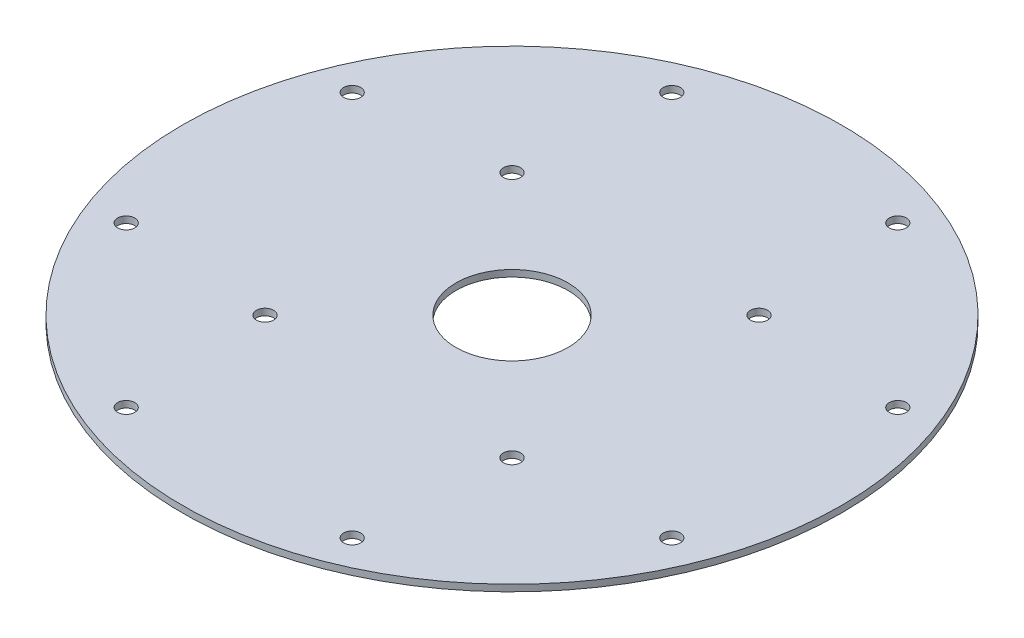
ISO-10303-21;
HEADER;
FILE_DESCRIPTION(('STEP AP214'),'2;1');
FILE_NAME('part.step','',(''),(''),'','','');
FILE_SCHEMA(('AUTOMOTIVE_DESIGN { 1 0 10303 214 1 1 1 1 }'));
ENDSEC;
DATA;
#1=APPLICATION_CONTEXT('core data for automotive mechanical design processes');
#2=APPLICATION_PROTOCOL_DEFINITION('international standard','automotive_design',2000,#1);
#3=PRODUCT_CONTEXT('',#1,'mechanical');
#4=PRODUCT('Part','Part','',(#3));
#5=PRODUCT_RELATED_PRODUCT_CATEGORY('part','',(#4));
#6=PRODUCT_DEFINITION_FORMATION('','',#4);
#7=PRODUCT_DEFINITION_CONTEXT('part definition',#1,'design');
#8=PRODUCT_DEFINITION('design','',#6,#7);
#9=PRODUCT_DEFINITION_SHAPE('','',#8);
#10=(LENGTH_UNIT() NAMED_UNIT(*) SI_UNIT(.MILLI.,.METRE.));
#11=(NAMED_UNIT(*) PLANE_ANGLE_UNIT() SI_UNIT($,.RADIAN.));
#12=(NAMED_UNIT(*) SI_UNIT($,.STERADIAN.) SOLID_ANGLE_UNIT());
#13=UNCERTAINTY_MEASURE_WITH_UNIT(LENGTH_MEASURE(1.E-05),#10,'distance_accuracy_value','');
#14=(GEOMETRIC_REPRESENTATION_CONTEXT(3) GLOBAL_UNCERTAINTY_ASSIGNED_CONTEXT((#13)) GLOBAL_UNIT_ASSIGNED_CONTEXT((#10,
#11,#12)) REPRESENTATION_CONTEXT('',''));
#15=CARTESIAN_POINT('',(0.,0.,0.));
#16=DIRECTION('',(0.,0.,1.));
#17=DIRECTION('',(1.,0.,0.));
#18=AXIS2_PLACEMENT_3D('',#15,#16,#17);
#19=CARTESIAN_POINT('',(-250.001181375406,148.003031099031,0.00373171541037616));
#20=DIRECTION('',(0.,-1.,0.));
#21=DIRECTION('',(1.,0.,0.));
#22=AXIS2_PLACEMENT_3D('',#19,#20,#21);
#23=CYLINDRICAL_SURFACE('',#22,250.);
#24=CARTESIAN_POINT('',(-250.001181375406,148.003031099031,0.00373171541037616));
#25=DIRECTION('',(0.,-1.,0.));
#26=DIRECTION('',(1.,0.,0.));
#27=AXIS2_PLACEMENT_3D('',#24,#25,#26);
#28=CIRCLE('',#27,250.);
#29=CARTESIAN_POINT('',(-0.00118137540600083,148.00303109903,0.00373171541037616));
#30=VERTEX_POINT('',#29);
#31=EDGE_CURVE('E80',#30,#30,#28,.T.);
#32=ORIENTED_EDGE('',*,*,#31,.T.);
#33=EDGE_LOOP('',(#32));
#34=FACE_BOUND('',#33,.T.);
#35=CARTESIAN_POINT('',(-250.001181375406,143.003031099031,0.00373171541037953));
#36=DIRECTION('',(0.,-1.,0.));
#37=DIRECTION('',(1.,0.,0.));
#38=AXIS2_PLACEMENT_3D('',#35,#36,#37);
#39=CIRCLE('',#38,250.);
#40=CARTESIAN_POINT('',(-0.00118137540605634,143.00303109903,0.00373171541037953));
#41=VERTEX_POINT('',#40);
#42=EDGE_CURVE('E52',#41,#41,#39,.T.);
#43=ORIENTED_EDGE('',*,*,#42,.F.);
#44=EDGE_LOOP('',(#43));
#45=FACE_BOUND('',#44,.T.);
#46=ADVANCED_FACE('F35',(#34,#45),#23,.T.);
#47=CARTESIAN_POINT('',(-335.722270225174,148.003031099032,206.952746997943));
#48=DIRECTION('',(0.,1.,0.));
#49=DIRECTION('',(-1.,0.,0.));
#50=AXIS2_PLACEMENT_3D('',#47,#48,#49);
#51=CYLINDRICAL_SURFACE('',#50,6.5);
#52=CARTESIAN_POINT('',(-335.722270225174,148.003031099032,206.952746997943));
#53=DIRECTION('',(0.,1.,0.));
#54=DIRECTION('',(-1.,0.,0.));
#55=AXIS2_PLACEMENT_3D('',#52,#53,#54);
#56=CIRCLE('',#55,6.5);
#57=CARTESIAN_POINT('',(-342.222270225174,148.003031099032,206.952746997943));
#58=VERTEX_POINT('',#57);
#59=EDGE_CURVE('E107',#58,#58,#56,.F.);
#60=ORIENTED_EDGE('',*,*,#59,.F.);
#61=EDGE_LOOP('',(#60));
#62=FACE_BOUND('',#61,.T.);
#63=CARTESIAN_POINT('',(-335.722270225174,143.003031099032,206.952746997943));
#64=DIRECTION('',(0.,1.,0.));
#65=DIRECTION('',(-1.,0.,0.));
#66=AXIS2_PLACEMENT_3D('',#63,#64,#65);
#67=CIRCLE('',#66,6.5);
#68=CARTESIAN_POINT('',(-342.222270225174,143.003031099032,206.952746997943));
#69=VERTEX_POINT('',#68);
#70=EDGE_CURVE('E55',#69,#69,#67,.F.);
#71=ORIENTED_EDGE('',*,*,#70,.T.);
#72=EDGE_LOOP('',(#71));
#73=FACE_BOUND('',#72,.T.);
#74=ADVANCED_FACE('F155',(#62,#73),#51,.F.);
#75=CARTESIAN_POINT('',(-456.950196657929,148.003031099032,85.7248205652019));
#76=DIRECTION('',(0.,1.,0.));
#77=DIRECTION('',(-1.,0.,0.));
#78=AXIS2_PLACEMENT_3D('',#75,#76,#77);
#79=CYLINDRICAL_SURFACE('',#78,6.5);
#80=CARTESIAN_POINT('',(-456.950196657929,148.003031099032,85.7248205652019));
#81=DIRECTION('',(0.,1.,0.));
#82=DIRECTION('',(-1.,0.,0.));
#83=AXIS2_PLACEMENT_3D('',#80,#81,#82);
#84=CIRCLE('',#83,6.5);
#85=CARTESIAN_POINT('',(-463.450196657929,148.003031099032,85.7248205652019));
#86=VERTEX_POINT('',#85);
#87=EDGE_CURVE('E110',#86,#86,#84,.F.);
#88=ORIENTED_EDGE('',*,*,#87,.F.);
#89=EDGE_LOOP('',(#88));
#90=FACE_BOUND('',#89,.T.);
#91=CARTESIAN_POINT('',(-456.950196657929,143.003031099032,85.7248205652019));
#92=DIRECTION('',(0.,1.,0.));
#93=DIRECTION('',(-1.,0.,0.));
#94=AXIS2_PLACEMENT_3D('',#91,#92,#93);
#95=CIRCLE('',#94,6.5);
#96=CARTESIAN_POINT('',(-463.450196657929,143.003031099032,85.7248205652019));
#97=VERTEX_POINT('',#96);
#98=EDGE_CURVE('E59',#97,#97,#95,.F.);
#99=ORIENTED_EDGE('',*,*,#98,.T.);
#100=EDGE_LOOP('',(#99));
#101=FACE_BOUND('',#100,.T.);
#102=ADVANCED_FACE('F161',(#90,#101),#79,.F.);
#103=CARTESIAN_POINT('',(-456.950196657939,148.003031099032,-85.7173571343583));
#104=DIRECTION('',(0.,1.,0.));
#105=DIRECTION('',(-1.,0.,0.));
#106=AXIS2_PLACEMENT_3D('',#103,#104,#105);
#107=CYLINDRICAL_SURFACE('',#106,6.5);
#108=CARTESIAN_POINT('',(-456.950196657939,148.003031099032,-85.7173571343583));
#109=DIRECTION('',(0.,1.,0.));
#110=DIRECTION('',(-1.,0.,0.));
#111=AXIS2_PLACEMENT_3D('',#108,#109,#110);
#112=CIRCLE('',#111,6.5);
#113=CARTESIAN_POINT('',(-463.450196657939,148.003031099032,-85.7173571343583));
#114=VERTEX_POINT('',#113);
#115=EDGE_CURVE('E113',#114,#114,#112,.F.);
#116=ORIENTED_EDGE('',*,*,#115,.F.);
#117=EDGE_LOOP('',(#116));
#118=FACE_BOUND('',#117,.T.);
#119=CARTESIAN_POINT('',(-456.950196657939,143.003031099032,-85.7173571343583));
#120=DIRECTION('',(0.,1.,0.));
#121=DIRECTION('',(-1.,0.,0.));
#122=AXIS2_PLACEMENT_3D('',#119,#120,#121);
#123=CIRCLE('',#122,6.5);
#124=CARTESIAN_POINT('',(-463.450196657939,143.003031099032,-85.7173571343583));
#125=VERTEX_POINT('',#124);
#126=EDGE_CURVE('E62',#125,#125,#123,.F.);
#127=ORIENTED_EDGE('',*,*,#126,.T.);
#128=EDGE_LOOP('',(#127));
#129=FACE_BOUND('',#128,.T.);
#130=ADVANCED_FACE('F168',(#118,#129),#107,.F.);
#131=CARTESIAN_POINT('',(-335.722270225197,148.003031099031,-206.945283567113));
#132=DIRECTION('',(0.,1.,0.));
#133=DIRECTION('',(-1.,0.,0.));
#134=AXIS2_PLACEMENT_3D('',#131,#132,#133);
#135=CYLINDRICAL_SURFACE('',#134,6.5);
#136=CARTESIAN_POINT('',(-335.722270225197,148.003031099031,-206.945283567113));
#137=DIRECTION('',(0.,1.,0.));
#138=DIRECTION('',(-1.,0.,0.));
#139=AXIS2_PLACEMENT_3D('',#136,#137,#138);
#140=CIRCLE('',#139,6.5);
#141=CARTESIAN_POINT('',(-342.222270225197,148.003031099031,-206.945283567113));
#142=VERTEX_POINT('',#141);
#143=EDGE_CURVE('E116',#142,#142,#140,.F.);
#144=ORIENTED_EDGE('',*,*,#143,.F.);
#145=EDGE_LOOP('',(#144));
#146=FACE_BOUND('',#145,.T.);
#147=CARTESIAN_POINT('',(-335.722270225197,143.003031099031,-206.945283567113));
#148=DIRECTION('',(0.,1.,0.));
#149=DIRECTION('',(-1.,0.,0.));
#150=AXIS2_PLACEMENT_3D('',#147,#148,#149);
#151=CIRCLE('',#150,6.5);
#152=CARTESIAN_POINT('',(-342.222270225197,143.003031099031,-206.945283567113));
#153=VERTEX_POINT('',#152);
#154=EDGE_CURVE('E65',#153,#153,#151,.F.);
#155=ORIENTED_EDGE('',*,*,#154,.T.);
#156=EDGE_LOOP('',(#155));
#157=FACE_BOUND('',#156,.T.);
#158=ADVANCED_FACE('F172',(#146,#157),#135,.F.);
#159=CARTESIAN_POINT('',(-164.280092525637,148.00303109903,-206.945283567123));
#160=DIRECTION('',(0.,1.,0.));
#161=DIRECTION('',(-1.,0.,0.));
#162=AXIS2_PLACEMENT_3D('',#159,#160,#161);
#163=CYLINDRICAL_SURFACE('',#162,6.5);
#164=CARTESIAN_POINT('',(-164.280092525637,148.00303109903,-206.945283567123));
#165=DIRECTION('',(0.,1.,0.));
#166=DIRECTION('',(-1.,0.,0.));
#167=AXIS2_PLACEMENT_3D('',#164,#165,#166);
#168=CIRCLE('',#167,6.5);
#169=CARTESIAN_POINT('',(-170.780092525637,148.00303109903,-206.945283567123));
#170=VERTEX_POINT('',#169);
#171=EDGE_CURVE('E119',#170,#170,#168,.F.);
#172=ORIENTED_EDGE('',*,*,#171,.F.);
#173=EDGE_LOOP('',(#172));
#174=FACE_BOUND('',#173,.T.);
#175=CARTESIAN_POINT('',(-164.280092525637,143.00303109903,-206.945283567123));
#176=DIRECTION('',(0.,1.,0.));
#177=DIRECTION('',(-1.,0.,0.));
#178=AXIS2_PLACEMENT_3D('',#175,#176,#177);
#179=CIRCLE('',#178,6.5);
#180=CARTESIAN_POINT('',(-170.780092525637,143.00303109903,-206.945283567123));
#181=VERTEX_POINT('',#180);
#182=EDGE_CURVE('E68',#181,#181,#179,.F.);
#183=ORIENTED_EDGE('',*,*,#182,.T.);
#184=EDGE_LOOP('',(#183));
#185=FACE_BOUND('',#184,.T.);
#186=ADVANCED_FACE('F131',(#174,#185),#163,.F.);
#187=CARTESIAN_POINT('',(-43.0521660928822,148.003031099029,-85.7173571343812));
#188=DIRECTION('',(0.,1.,0.));
#189=DIRECTION('',(-1.,0.,0.));
#190=AXIS2_PLACEMENT_3D('',#187,#188,#189);
#191=CYLINDRICAL_SURFACE('',#190,6.5);
#192=CARTESIAN_POINT('',(-43.0521660928822,148.003031099029,-85.7173571343812));
#193=DIRECTION('',(0.,1.,0.));
#194=DIRECTION('',(-1.,0.,0.));
#195=AXIS2_PLACEMENT_3D('',#192,#193,#194);
#196=CIRCLE('',#195,6.5);
#197=CARTESIAN_POINT('',(-49.5521660928822,148.003031099029,-85.7173571343812));
#198=VERTEX_POINT('',#197);
#199=EDGE_CURVE('E48',#198,#198,#196,.F.);
#200=ORIENTED_EDGE('',*,*,#199,.F.);
#201=EDGE_LOOP('',(#200));
#202=FACE_BOUND('',#201,.T.);
#203=CARTESIAN_POINT('',(-43.0521660928822,143.003031099029,-85.7173571343812));
#204=DIRECTION('',(0.,1.,0.));
#205=DIRECTION('',(-1.,0.,0.));
#206=AXIS2_PLACEMENT_3D('',#203,#204,#205);
#207=CIRCLE('',#206,6.5);
#208=CARTESIAN_POINT('',(-49.5521660928822,143.003031099029,-85.7173571343812));
#209=VERTEX_POINT('',#208);
#210=EDGE_CURVE('E71',#209,#209,#207,.F.);
#211=ORIENTED_EDGE('',*,*,#210,.T.);
#212=EDGE_LOOP('',(#211));
#213=FACE_BOUND('',#212,.T.);
#214=ADVANCED_FACE('F127',(#202,#213),#191,.F.);
#215=CARTESIAN_POINT('',(-43.0521660928727,148.003031099029,85.724820565179));
#216=DIRECTION('',(0.,1.,0.));
#217=DIRECTION('',(-1.,0.,0.));
#218=AXIS2_PLACEMENT_3D('',#215,#216,#217);
#219=CYLINDRICAL_SURFACE('',#218,6.5);
#220=CARTESIAN_POINT('',(-43.0521660928727,148.003031099029,85.724820565179));
#221=DIRECTION('',(0.,1.,0.));
#222=DIRECTION('',(-1.,0.,0.));
#223=AXIS2_PLACEMENT_3D('',#220,#221,#222);
#224=CIRCLE('',#223,6.5);
#225=CARTESIAN_POINT('',(-49.5521660928727,148.003031099029,85.724820565179));
#226=VERTEX_POINT('',#225);
#227=EDGE_CURVE('E43',#226,#226,#224,.F.);
#228=ORIENTED_EDGE('',*,*,#227,.F.);
#229=EDGE_LOOP('',(#228));
#230=FACE_BOUND('',#229,.T.);
#231=CARTESIAN_POINT('',(-43.0521660928727,143.003031099029,85.724820565179));
#232=DIRECTION('',(0.,1.,0.));
#233=DIRECTION('',(-1.,0.,0.));
#234=AXIS2_PLACEMENT_3D('',#231,#232,#233);
#235=CIRCLE('',#234,6.5);
#236=CARTESIAN_POINT('',(-49.5521660928727,143.003031099029,85.724820565179));
#237=VERTEX_POINT('',#236);
#238=EDGE_CURVE('E74',#237,#237,#235,.F.);
#239=ORIENTED_EDGE('',*,*,#238,.T.);
#240=EDGE_LOOP('',(#239));
#241=FACE_BOUND('',#240,.T.);
#242=ADVANCED_FACE('F130',(#230,#241),#219,.F.);
#243=CARTESIAN_POINT('',(-164.280092525614,148.00303109903,206.952746997934));
#244=DIRECTION('',(0.,1.,0.));
#245=DIRECTION('',(-1.,0.,0.));
#246=AXIS2_PLACEMENT_3D('',#243,#244,#245);
#247=CYLINDRICAL_SURFACE('',#246,6.5);
#248=CARTESIAN_POINT('',(-164.280092525614,148.00303109903,206.952746997934));
#249=DIRECTION('',(0.,1.,0.));
#250=DIRECTION('',(-1.,0.,0.));
#251=AXIS2_PLACEMENT_3D('',#248,#249,#250);
#252=CIRCLE('',#251,6.5);
#253=CARTESIAN_POINT('',(-170.780092525614,148.00303109903,206.952746997934));
#254=VERTEX_POINT('',#253);
#255=EDGE_CURVE('E10',#254,#254,#252,.F.);
#256=ORIENTED_EDGE('',*,*,#255,.F.);
#257=EDGE_LOOP('',(#256));
#258=FACE_BOUND('',#257,.T.);
#259=CARTESIAN_POINT('',(-164.280092525614,143.00303109903,206.952746997934));
#260=DIRECTION('',(0.,1.,0.));
#261=DIRECTION('',(-1.,0.,0.));
#262=AXIS2_PLACEMENT_3D('',#259,#260,#261);
#263=CIRCLE('',#262,6.5);
#264=CARTESIAN_POINT('',(-170.780092525614,143.00303109903,206.952746997934));
#265=VERTEX_POINT('',#264);
#266=EDGE_CURVE('E77',#265,#265,#263,.F.);
#267=ORIENTED_EDGE('',*,*,#266,.T.);
#268=EDGE_LOOP('',(#267));
#269=FACE_BOUND('',#268,.T.);
#270=ADVANCED_FACE('F37',(#258,#269),#247,.F.);
#271=CARTESIAN_POINT('',(-250.001181375413,148.003031099031,-124.99626828459));
#272=DIRECTION('',(0.,1.,0.));
#273=DIRECTION('',(-1.,0.,0.));
#274=AXIS2_PLACEMENT_3D('',#271,#272,#273);
#275=PLANE('',#274);
#276=CARTESIAN_POINT('',(-250.001181375406,148.003031099031,0.0037317154103789));
#277=DIRECTION('',(0.,1.,0.));
#278=DIRECTION('',(-1.,0.,0.));
#279=AXIS2_PLACEMENT_3D('',#276,#277,#278);
#280=CIRCLE('',#279,42.5);
#281=CARTESIAN_POINT('',(-292.501181375406,148.003031099031,0.0037317154103789));
#282=VERTEX_POINT('',#281);
#283=EDGE_CURVE('E372',#282,#282,#280,.T.);
#284=ORIENTED_EDGE('',*,*,#283,.F.);
#285=EDGE_LOOP('',(#284));
#286=FACE_BOUND('',#285,.T.);
#287=CARTESIAN_POINT('',(-156.309532868188,148.003031099031,93.6953802226278));
#288=DIRECTION('',(0.,1.,0.));
#289=DIRECTION('',(0.,0.,1.));
#290=AXIS2_PLACEMENT_3D('',#287,#288,#289);
#291=CIRCLE('',#290,6.50000000000001);
#292=CARTESIAN_POINT('',(-156.309532868188,148.003031099031,100.195380222628));
#293=VERTEX_POINT('',#292);
#294=EDGE_CURVE('E97',#293,#293,#291,.T.);
#295=ORIENTED_EDGE('',*,*,#294,.F.);
#296=EDGE_LOOP('',(#295));
#297=FACE_BOUND('',#296,.T.);
#298=CARTESIAN_POINT('',(-343.692829882623,148.003031099032,93.6953802226281));
#299=DIRECTION('',(0.,1.,0.));
#300=DIRECTION('',(0.,0.,1.));
#301=AXIS2_PLACEMENT_3D('',#298,#299,#300);
#302=CIRCLE('',#301,6.50000000000001);
#303=CARTESIAN_POINT('',(-343.692829882623,148.003031099032,100.195380222628));
#304=VERTEX_POINT('',#303);
#305=EDGE_CURVE('E87',#304,#304,#302,.T.);
#306=ORIENTED_EDGE('',*,*,#305,.F.);
#307=EDGE_LOOP('',(#306));
#308=FACE_BOUND('',#307,.T.);
#309=CARTESIAN_POINT('',(-343.692829882623,148.003031099032,-93.6879167918077));
#310=DIRECTION('',(0.,1.,0.));
#311=DIRECTION('',(0.,0.,1.));
#312=AXIS2_PLACEMENT_3D('',#309,#310,#311);
#313=CIRCLE('',#312,6.50000000000001);
#314=CARTESIAN_POINT('',(-343.692829882623,148.003031099032,-87.1879167918077));
#315=VERTEX_POINT('',#314);
#316=EDGE_CURVE('E84',#315,#315,#313,.T.);
#317=ORIENTED_EDGE('',*,*,#316,.F.);
#318=EDGE_LOOP('',(#317));
#319=FACE_BOUND('',#318,.T.);
#320=CARTESIAN_POINT('',(-156.309532868188,148.00303109903,-93.6879167918074));
#321=DIRECTION('',(0.,1.,0.));
#322=DIRECTION('',(0.,0.,1.));
#323=AXIS2_PLACEMENT_3D('',#320,#321,#322);
#324=CIRCLE('',#323,6.50000000000001);
#325=CARTESIAN_POINT('',(-156.309532868188,148.00303109903,-87.1879167918073));
#326=VERTEX_POINT('',#325);
#327=EDGE_CURVE('E83',#326,#326,#324,.T.);
#328=ORIENTED_EDGE('',*,*,#327,.F.);
#329=EDGE_LOOP('',(#328));
#330=FACE_BOUND('',#329,.T.);
#331=ORIENTED_EDGE('',*,*,#31,.F.);
#332=EDGE_LOOP('',(#331));
#333=FACE_BOUND('',#332,.T.);
#334=ORIENTED_EDGE('',*,*,#59,.T.);
#335=EDGE_LOOP('',(#334));
#336=FACE_BOUND('',#335,.T.);
#337=ORIENTED_EDGE('',*,*,#87,.T.);
#338=EDGE_LOOP('',(#337));
#339=FACE_BOUND('',#338,.T.);
#340=ORIENTED_EDGE('',*,*,#115,.T.);
#341=EDGE_LOOP('',(#340));
#342=FACE_BOUND('',#341,.T.);
#343=ORIENTED_EDGE('',*,*,#143,.T.);
#344=EDGE_LOOP('',(#343));
#345=FACE_BOUND('',#344,.T.);
#346=ORIENTED_EDGE('',*,*,#171,.T.);
#347=EDGE_LOOP('',(#346));
#348=FACE_BOUND('',#347,.T.);
#349=ORIENTED_EDGE('',*,*,#199,.T.);
#350=EDGE_LOOP('',(#349));
#351=FACE_BOUND('',#350,.T.);
#352=ORIENTED_EDGE('',*,*,#227,.T.);
#353=EDGE_LOOP('',(#352));
#354=FACE_BOUND('',#353,.T.);
#355=ORIENTED_EDGE('',*,*,#255,.T.);
#356=EDGE_LOOP('',(#355));
#357=FACE_BOUND('',#356,.T.);
#358=ADVANCED_FACE('F124',(#286,#297,#308,#319,#330,#333,#336,#339,#342,#345,#348,#351,#354,
#357),#275,.T.);
#359=CARTESIAN_POINT('',(-250.001181375413,143.003031099031,-124.99626828459));
#360=DIRECTION('',(0.,1.,0.));
#361=DIRECTION('',(-1.,0.,0.));
#362=AXIS2_PLACEMENT_3D('',#359,#360,#361);
#363=PLANE('',#362);
#364=CARTESIAN_POINT('',(-250.001181375406,143.003031099031,0.00373171541038226));
#365=DIRECTION('',(0.,-1.,0.));
#366=DIRECTION('',(1.,0.,0.));
#367=AXIS2_PLACEMENT_3D('',#364,#365,#366);
#368=CIRCLE('',#367,42.5);
#369=CARTESIAN_POINT('',(-207.501181375406,143.003031099031,0.00373171541038226));
#370=VERTEX_POINT('',#369);
#371=EDGE_CURVE('E375',#370,#370,#368,.T.);
#372=ORIENTED_EDGE('',*,*,#371,.F.);
#373=EDGE_LOOP('',(#372));
#374=FACE_BOUND('',#373,.T.);
#375=CARTESIAN_POINT('',(-156.309532868188,143.003031099031,93.6953802226278));
#376=DIRECTION('',(0.,1.,0.));
#377=DIRECTION('',(-1.,0.,0.));
#378=AXIS2_PLACEMENT_3D('',#375,#376,#377);
#379=CIRCLE('',#378,6.50000000000001);
#380=CARTESIAN_POINT('',(-162.809532868188,143.003031099031,93.6953802226278));
#381=VERTEX_POINT('',#380);
#382=EDGE_CURVE('E39',#381,#381,#379,.T.);
#383=ORIENTED_EDGE('',*,*,#382,.T.);
#384=EDGE_LOOP('',(#383));
#385=FACE_BOUND('',#384,.T.);
#386=CARTESIAN_POINT('',(-343.692829882623,143.003031099032,93.6953802226281));
#387=DIRECTION('',(0.,1.,0.));
#388=DIRECTION('',(-1.,0.,0.));
#389=AXIS2_PLACEMENT_3D('',#386,#387,#388);
#390=CIRCLE('',#389,6.50000000000001);
#391=CARTESIAN_POINT('',(-350.192829882623,143.003031099032,93.6953802226281));
#392=VERTEX_POINT('',#391);
#393=EDGE_CURVE('E85',#392,#392,#390,.T.);
#394=ORIENTED_EDGE('',*,*,#393,.T.);
#395=EDGE_LOOP('',(#394));
#396=FACE_BOUND('',#395,.T.);
#397=CARTESIAN_POINT('',(-343.692829882623,143.003031099032,-93.6879167918077));
#398=DIRECTION('',(0.,1.,0.));
#399=DIRECTION('',(-1.,0.,0.));
#400=AXIS2_PLACEMENT_3D('',#397,#398,#399);
#401=CIRCLE('',#400,6.50000000000001);
#402=CARTESIAN_POINT('',(-350.192829882623,143.003031099032,-93.6879167918077));
#403=VERTEX_POINT('',#402);
#404=EDGE_CURVE('E81',#403,#403,#401,.T.);
#405=ORIENTED_EDGE('',*,*,#404,.T.);
#406=EDGE_LOOP('',(#405));
#407=FACE_BOUND('',#406,.T.);
#408=CARTESIAN_POINT('',(-156.309532868188,143.00303109903,-93.6879167918074));
#409=DIRECTION('',(0.,1.,0.));
#410=DIRECTION('',(-1.,0.,0.));
#411=AXIS2_PLACEMENT_3D('',#408,#409,#410);
#412=CIRCLE('',#411,6.50000000000001);
#413=CARTESIAN_POINT('',(-162.809532868188,143.00303109903,-93.6879167918074));
#414=VERTEX_POINT('',#413);
#415=EDGE_CURVE('E56',#414,#414,#412,.T.);
#416=ORIENTED_EDGE('',*,*,#415,.T.);
#417=EDGE_LOOP('',(#416));
#418=FACE_BOUND('',#417,.T.);
#419=ORIENTED_EDGE('',*,*,#42,.T.);
#420=EDGE_LOOP('',(#419));
#421=FACE_BOUND('',#420,.T.);
#422=ORIENTED_EDGE('',*,*,#70,.F.);
#423=EDGE_LOOP('',(#422));
#424=FACE_BOUND('',#423,.T.);
#425=ORIENTED_EDGE('',*,*,#98,.F.);
#426=EDGE_LOOP('',(#425));
#427=FACE_BOUND('',#426,.T.);
#428=ORIENTED_EDGE('',*,*,#126,.F.);
#429=EDGE_LOOP('',(#428));
#430=FACE_BOUND('',#429,.T.);
#431=ORIENTED_EDGE('',*,*,#154,.F.);
#432=EDGE_LOOP('',(#431));
#433=FACE_BOUND('',#432,.T.);
#434=ORIENTED_EDGE('',*,*,#182,.F.);
#435=EDGE_LOOP('',(#434));
#436=FACE_BOUND('',#435,.T.);
#437=ORIENTED_EDGE('',*,*,#210,.F.);
#438=EDGE_LOOP('',(#437));
#439=FACE_BOUND('',#438,.T.);
#440=ORIENTED_EDGE('',*,*,#238,.F.);
#441=EDGE_LOOP('',(#440));
#442=FACE_BOUND('',#441,.T.);
#443=ORIENTED_EDGE('',*,*,#266,.F.);
#444=EDGE_LOOP('',(#443));
#445=FACE_BOUND('',#444,.T.);
#446=ADVANCED_FACE('F135',(#374,#385,#396,#407,#418,#421,#424,#427,#430,#433,#436,#439,#442,
#445),#363,.F.);
#447=CARTESIAN_POINT('',(-156.309532868188,148.00303109903,-93.6879167918074));
#448=DIRECTION('',(0.,1.,0.));
#449=DIRECTION('',(0.,0.,1.));
#450=AXIS2_PLACEMENT_3D('',#447,#448,#449);
#451=CYLINDRICAL_SURFACE('',#450,6.50000000000001);
#452=ORIENTED_EDGE('',*,*,#327,.T.);
#453=EDGE_LOOP('',(#452));
#454=FACE_BOUND('',#453,.T.);
#455=ORIENTED_EDGE('',*,*,#415,.F.);
#456=EDGE_LOOP('',(#455));
#457=FACE_BOUND('',#456,.T.);
#458=ADVANCED_FACE('F138',(#454,#457),#451,.F.);
#459=CARTESIAN_POINT('',(-343.692829882623,148.003031099032,-93.6879167918077));
#460=DIRECTION('',(0.,1.,0.));
#461=DIRECTION('',(0.,0.,1.));
#462=AXIS2_PLACEMENT_3D('',#459,#460,#461);
#463=CYLINDRICAL_SURFACE('',#462,6.50000000000001);
#464=ORIENTED_EDGE('',*,*,#316,.T.);
#465=EDGE_LOOP('',(#464));
#466=FACE_BOUND('',#465,.T.);
#467=ORIENTED_EDGE('',*,*,#404,.F.);
#468=EDGE_LOOP('',(#467));
#469=FACE_BOUND('',#468,.T.);
#470=ADVANCED_FACE('F212',(#466,#469),#463,.F.);
#471=CARTESIAN_POINT('',(-343.692829882623,148.003031099032,93.6953802226281));
#472=DIRECTION('',(0.,1.,0.));
#473=DIRECTION('',(0.,0.,1.));
#474=AXIS2_PLACEMENT_3D('',#471,#472,#473);
#475=CYLINDRICAL_SURFACE('',#474,6.50000000000001);
#476=ORIENTED_EDGE('',*,*,#305,.T.);
#477=EDGE_LOOP('',(#476));
#478=FACE_BOUND('',#477,.T.);
#479=ORIENTED_EDGE('',*,*,#393,.F.);
#480=EDGE_LOOP('',(#479));
#481=FACE_BOUND('',#480,.T.);
#482=ADVANCED_FACE('F223',(#478,#481),#475,.F.);
#483=CARTESIAN_POINT('',(-156.309532868188,148.003031099031,93.6953802226278));
#484=DIRECTION('',(0.,1.,0.));
#485=DIRECTION('',(0.,0.,1.));
#486=AXIS2_PLACEMENT_3D('',#483,#484,#485);
#487=CYLINDRICAL_SURFACE('',#486,6.50000000000001);
#488=ORIENTED_EDGE('',*,*,#294,.T.);
#489=EDGE_LOOP('',(#488));
#490=FACE_BOUND('',#489,.T.);
#491=ORIENTED_EDGE('',*,*,#382,.F.);
#492=EDGE_LOOP('',(#491));
#493=FACE_BOUND('',#492,.T.);
#494=ADVANCED_FACE('F233',(#490,#493),#487,.F.);
#495=CARTESIAN_POINT('',(-250.001181375406,153.003031099031,0.00373171541037553));
#496=DIRECTION('',(0.,-1.,0.));
#497=DIRECTION('',(1.,0.,0.));
#498=AXIS2_PLACEMENT_3D('',#495,#496,#497);
#499=CYLINDRICAL_SURFACE('',#498,42.5);
#500=ORIENTED_EDGE('',*,*,#283,.T.);
#501=EDGE_LOOP('',(#500));
#502=FACE_BOUND('',#501,.T.);
#503=ORIENTED_EDGE('',*,*,#371,.T.);
#504=EDGE_LOOP('',(#503));
#505=FACE_BOUND('',#504,.T.);
#506=ADVANCED_FACE('F242',(#502,#505),#499,.F.);
#507=CLOSED_SHELL('',(#46,#74,#102,#130,#158,#186,#214,#242,#270,#358,#446,#458,#470,#482,#494,#506));
#508=MANIFOLD_SOLID_BREP('B2',#507);
#509=ADVANCED_BREP_SHAPE_REPRESENTATION('',(#18,#508),#14);
#510=SHAPE_DEFINITION_REPRESENTATION(#9,#509);
ENDSEC;
END-ISO-10303-21;
